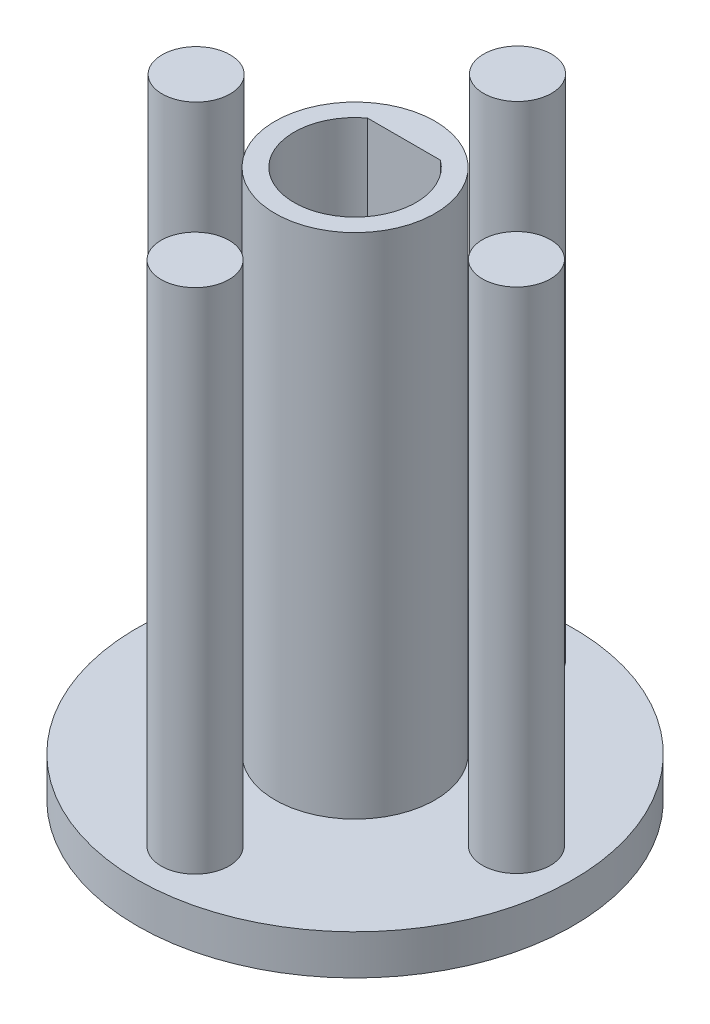
ISO-10303-21;
HEADER;
FILE_DESCRIPTION(('STEP AP214'),'2;1');
FILE_NAME('part.step','',(''),(''),'','','');
FILE_SCHEMA(('AUTOMOTIVE_DESIGN { 1 0 10303 214 1 1 1 1 }'));
ENDSEC;
DATA;
#1=APPLICATION_CONTEXT('core data for automotive mechanical design processes');
#2=APPLICATION_PROTOCOL_DEFINITION('international standard','automotive_design',2000,#1);
#3=PRODUCT_CONTEXT('',#1,'mechanical');
#4=PRODUCT('Part','Part','',(#3));
#5=PRODUCT_RELATED_PRODUCT_CATEGORY('part','',(#4));
#6=PRODUCT_DEFINITION_FORMATION('','',#4);
#7=PRODUCT_DEFINITION_CONTEXT('part definition',#1,'design');
#8=PRODUCT_DEFINITION('design','',#6,#7);
#9=PRODUCT_DEFINITION_SHAPE('','',#8);
#10=(LENGTH_UNIT() NAMED_UNIT(*) SI_UNIT(.MILLI.,.METRE.));
#11=(NAMED_UNIT(*) PLANE_ANGLE_UNIT() SI_UNIT($,.RADIAN.));
#12=(NAMED_UNIT(*) SI_UNIT($,.STERADIAN.) SOLID_ANGLE_UNIT());
#13=UNCERTAINTY_MEASURE_WITH_UNIT(LENGTH_MEASURE(1.E-05),#10,'distance_accuracy_value','');
#14=(GEOMETRIC_REPRESENTATION_CONTEXT(3) GLOBAL_UNCERTAINTY_ASSIGNED_CONTEXT((#13)) GLOBAL_UNIT_ASSIGNED_CONTEXT((#10,
#11,#12)) REPRESENTATION_CONTEXT('',''));
#15=CARTESIAN_POINT('',(0.,0.,0.));
#16=DIRECTION('',(0.,0.,1.));
#17=DIRECTION('',(1.,0.,0.));
#18=AXIS2_PLACEMENT_3D('',#15,#16,#17);
#19=CARTESIAN_POINT('',(0.,2.,0.));
#20=DIRECTION('',(0.,1.,0.));
#21=DIRECTION('',(0.,0.,1.));
#22=AXIS2_PLACEMENT_3D('',#19,#20,#21);
#23=PLANE('',#22);
#24=CARTESIAN_POINT('',(0.,2.,0.));
#25=DIRECTION('',(0.,1.,0.));
#26=DIRECTION('',(0.,0.,1.));
#27=AXIS2_PLACEMENT_3D('',#24,#25,#26);
#28=CIRCLE('',#27,10.9);
#29=CARTESIAN_POINT('',(0.,2.,10.9));
#30=VERTEX_POINT('',#29);
#31=EDGE_CURVE('E112',#30,#30,#28,.T.);
#32=ORIENTED_EDGE('',*,*,#31,.T.);
#33=EDGE_LOOP('',(#32));
#34=FACE_BOUND('',#33,.T.);
#35=CARTESIAN_POINT('',(-7.99946540436632,2.,-0.0531912101153402));
#36=DIRECTION('',(0.,1.,0.));
#37=DIRECTION('',(0.,0.,1.));
#38=AXIS2_PLACEMENT_3D('',#35,#36,#37);
#39=CIRCLE('',#38,1.7);
#40=CARTESIAN_POINT('',(-7.99946540436632,1.99999999999999,-1.75319121011534));
#41=VERTEX_POINT('',#40);
#42=EDGE_CURVE('E48',#41,#41,#39,.T.);
#43=ORIENTED_EDGE('',*,*,#42,.F.);
#44=EDGE_LOOP('',(#43));
#45=FACE_BOUND('',#44,.T.);
#46=CARTESIAN_POINT('',(0.0091799489627781,2.,8.00905715153994));
#47=DIRECTION('',(0.,1.,0.));
#48=DIRECTION('',(0.,0.,1.));
#49=AXIS2_PLACEMENT_3D('',#46,#47,#48);
#50=CIRCLE('',#49,1.7);
#51=CARTESIAN_POINT('',(0.0091799489627781,1.99999999999999,6.30905715153994));
#52=VERTEX_POINT('',#51);
#53=EDGE_CURVE('E108',#52,#52,#50,.F.);
#54=ORIENTED_EDGE('',*,*,#53,.T.);
#55=EDGE_LOOP('',(#54));
#56=FACE_BOUND('',#55,.T.);
#57=CARTESIAN_POINT('',(8.01767982733765,2.,-0.0533357152510716));
#58=DIRECTION('',(0.,1.,0.));
#59=DIRECTION('',(0.,0.,1.));
#60=AXIS2_PLACEMENT_3D('',#57,#58,#59);
#61=CIRCLE('',#60,1.7);
#62=CARTESIAN_POINT('',(8.01767982733765,1.99999999999999,-1.75333571525107));
#63=VERTEX_POINT('',#62);
#64=EDGE_CURVE('E102',#63,#63,#61,.F.);
#65=ORIENTED_EDGE('',*,*,#64,.T.);
#66=EDGE_LOOP('',(#65));
#67=FACE_BOUND('',#66,.T.);
#68=CARTESIAN_POINT('',(0.00903447400855788,2.,-8.11558407690636));
#69=DIRECTION('',(0.,1.,0.));
#70=DIRECTION('',(0.,0.,1.));
#71=AXIS2_PLACEMENT_3D('',#68,#69,#70);
#72=CIRCLE('',#71,1.7);
#73=CARTESIAN_POINT('',(0.00903447400855788,1.99999999999999,-9.81558407690635));
#74=VERTEX_POINT('',#73);
#75=EDGE_CURVE('E96',#74,#74,#72,.F.);
#76=ORIENTED_EDGE('',*,*,#75,.T.);
#77=EDGE_LOOP('',(#76));
#78=FACE_BOUND('',#77,.T.);
#79=CARTESIAN_POINT('',(0.,2.,0.));
#80=DIRECTION('',(0.,1.,0.));
#81=DIRECTION('',(0.,0.,1.));
#82=AXIS2_PLACEMENT_3D('',#79,#80,#81);
#83=CIRCLE('',#82,4.);
#84=CARTESIAN_POINT('',(0.,1.99999999999999,-4.));
#85=VERTEX_POINT('',#84);
#86=EDGE_CURVE('E90',#85,#85,#83,.F.);
#87=ORIENTED_EDGE('',*,*,#86,.T.);
#88=EDGE_LOOP('',(#87));
#89=FACE_BOUND('',#88,.T.);
#90=ADVANCED_FACE('F44',(#34,#45,#56,#67,#78,#89),#23,.T.);
#91=CARTESIAN_POINT('',(-7.99946540436632,27.4,-0.0531912101153402));
#92=DIRECTION('',(0.,-1.,0.));
#93=DIRECTION('',(0.,0.,-1.));
#94=AXIS2_PLACEMENT_3D('',#91,#92,#93);
#95=CYLINDRICAL_SURFACE('',#94,1.7);
#96=CARTESIAN_POINT('',(-7.99946540436632,27.4,-0.0531912101153402));
#97=DIRECTION('',(0.,1.,0.));
#98=DIRECTION('',(0.,0.,1.));
#99=AXIS2_PLACEMENT_3D('',#96,#97,#98);
#100=CIRCLE('',#99,1.7);
#101=CARTESIAN_POINT('',(-7.99946540436632,27.4,-1.75319121011534));
#102=VERTEX_POINT('',#101);
#103=EDGE_CURVE('E12',#102,#102,#100,.T.);
#104=CARTESIAN_POINT('',(-7.99946540436632,1.99999999999999,-1.75319121011534));
#105=CARTESIAN_POINT('',(-7.99946540436632,2.26458333333333,-1.75319121011534));
#106=CARTESIAN_POINT('',(-7.99946540436632,2.52916666666666,-1.75319121011534));
#107=CARTESIAN_POINT('',(-7.99946540436632,3.05833333333333,-1.75319121011534));
#108=CARTESIAN_POINT('',(-7.99946540436632,3.32291666666666,-1.75319121011534));
#109=CARTESIAN_POINT('',(-7.99946540436632,3.85208333333333,-1.75319121011534));
#110=CARTESIAN_POINT('',(-7.99946540436632,4.11666666666666,-1.75319121011534));
#111=CARTESIAN_POINT('',(-7.99946540436632,4.64583333333333,-1.75319121011534));
#112=CARTESIAN_POINT('',(-7.99946540436632,4.91041666666666,-1.75319121011534));
#113=CARTESIAN_POINT('',(-7.99946540436632,5.43958333333333,-1.75319121011534));
#114=CARTESIAN_POINT('',(-7.99946540436632,5.70416666666666,-1.75319121011534));
#115=CARTESIAN_POINT('',(-7.99946540436632,6.23333333333333,-1.75319121011534));
#116=CARTESIAN_POINT('',(-7.99946540436632,6.49791666666666,-1.75319121011534));
#117=CARTESIAN_POINT('',(-7.99946540436632,7.02708333333333,-1.75319121011534));
#118=CARTESIAN_POINT('',(-7.99946540436632,7.29166666666666,-1.75319121011534));
#119=CARTESIAN_POINT('',(-7.99946540436632,7.82083333333333,-1.75319121011534));
#120=CARTESIAN_POINT('',(-7.99946540436632,8.08541666666666,-1.75319121011534));
#121=CARTESIAN_POINT('',(-7.99946540436632,8.61458333333333,-1.75319121011534));
#122=CARTESIAN_POINT('',(-7.99946540436632,8.87916666666666,-1.75319121011534));
#123=CARTESIAN_POINT('',(-7.99946540436632,9.40833333333333,-1.75319121011534));
#124=CARTESIAN_POINT('',(-7.99946540436632,9.67291666666666,-1.75319121011534));
#125=CARTESIAN_POINT('',(-7.99946540436632,10.2020833333333,-1.75319121011534));
#126=CARTESIAN_POINT('',(-7.99946540436632,10.4666666666667,-1.75319121011534));
#127=CARTESIAN_POINT('',(-7.99946540436632,10.9958333333333,-1.75319121011534));
#128=CARTESIAN_POINT('',(-7.99946540436632,11.2604166666667,-1.75319121011534));
#129=CARTESIAN_POINT('',(-7.99946540436632,11.7895833333333,-1.75319121011534));
#130=CARTESIAN_POINT('',(-7.99946540436632,12.0541666666667,-1.75319121011534));
#131=CARTESIAN_POINT('',(-7.99946540436632,12.5833333333333,-1.75319121011534));
#132=CARTESIAN_POINT('',(-7.99946540436632,12.8479166666667,-1.75319121011534));
#133=CARTESIAN_POINT('',(-7.99946540436632,13.3770833333333,-1.75319121011534));
#134=CARTESIAN_POINT('',(-7.99946540436632,13.6416666666667,-1.75319121011534));
#135=CARTESIAN_POINT('',(-7.99946540436632,14.1708333333333,-1.75319121011534));
#136=CARTESIAN_POINT('',(-7.99946540436632,14.4354166666667,-1.75319121011534));
#137=CARTESIAN_POINT('',(-7.99946540436632,14.9645833333333,-1.75319121011534));
#138=CARTESIAN_POINT('',(-7.99946540436632,15.2291666666667,-1.75319121011534));
#139=CARTESIAN_POINT('',(-7.99946540436632,15.7583333333333,-1.75319121011534));
#140=CARTESIAN_POINT('',(-7.99946540436632,16.0229166666667,-1.75319121011534));
#141=CARTESIAN_POINT('',(-7.99946540436632,16.5520833333333,-1.75319121011534));
#142=CARTESIAN_POINT('',(-7.99946540436632,16.8166666666667,-1.75319121011534));
#143=CARTESIAN_POINT('',(-7.99946540436632,17.3458333333333,-1.75319121011534));
#144=CARTESIAN_POINT('',(-7.99946540436632,17.6104166666667,-1.75319121011534));
#145=CARTESIAN_POINT('',(-7.99946540436632,18.1395833333333,-1.75319121011534));
#146=CARTESIAN_POINT('',(-7.99946540436632,18.4041666666667,-1.75319121011534));
#147=CARTESIAN_POINT('',(-7.99946540436632,18.9333333333333,-1.75319121011534));
#148=CARTESIAN_POINT('',(-7.99946540436632,19.1979166666667,-1.75319121011534));
#149=CARTESIAN_POINT('',(-7.99946540436632,19.7270833333333,-1.75319121011534));
#150=CARTESIAN_POINT('',(-7.99946540436632,19.9916666666667,-1.75319121011534));
#151=CARTESIAN_POINT('',(-7.99946540436632,20.5208333333333,-1.75319121011534));
#152=CARTESIAN_POINT('',(-7.99946540436632,20.7854166666667,-1.75319121011534));
#153=CARTESIAN_POINT('',(-7.99946540436632,21.3145833333333,-1.75319121011534));
#154=CARTESIAN_POINT('',(-7.99946540436632,21.5791666666667,-1.75319121011534));
#155=CARTESIAN_POINT('',(-7.99946540436632,22.1083333333333,-1.75319121011534));
#156=CARTESIAN_POINT('',(-7.99946540436632,22.3729166666667,-1.75319121011534));
#157=CARTESIAN_POINT('',(-7.99946540436632,22.9020833333333,-1.75319121011534));
#158=CARTESIAN_POINT('',(-7.99946540436632,23.1666666666667,-1.75319121011534));
#159=CARTESIAN_POINT('',(-7.99946540436632,23.6958333333333,-1.75319121011534));
#160=CARTESIAN_POINT('',(-7.99946540436632,23.9604166666667,-1.75319121011534));
#161=CARTESIAN_POINT('',(-7.99946540436632,24.4895833333333,-1.75319121011534));
#162=CARTESIAN_POINT('',(-7.99946540436632,24.7541666666667,-1.75319121011534));
#163=CARTESIAN_POINT('',(-7.99946540436632,25.2833333333333,-1.75319121011534));
#164=CARTESIAN_POINT('',(-7.99946540436632,25.5479166666667,-1.75319121011534));
#165=CARTESIAN_POINT('',(-7.99946540436632,26.0770833333333,-1.75319121011534));
#166=CARTESIAN_POINT('',(-7.99946540436632,26.3416666666667,-1.75319121011534));
#167=CARTESIAN_POINT('',(-7.99946540436632,26.8708333333333,-1.75319121011534));
#168=CARTESIAN_POINT('',(-7.99946540436632,27.1354166666667,-1.75319121011534));
#169=CARTESIAN_POINT('',(-7.99946540436632,27.4,-1.75319121011534));
#170=B_SPLINE_CURVE_WITH_KNOTS('',3,(#104,#105,#106,#107,#108,#109,#110,#111,#112,#113,#114,
#115,#116,#117,#118,#119,#120,#121,#122,#123,#124,#125,#126,#127,#128,#129,#130,#131,#132,#133,
#134,#135,#136,#137,#138,#139,#140,#141,#142,#143,#144,#145,#146,#147,#148,#149,#150,#151,#152,
#153,#154,#155,#156,#157,#158,#159,#160,#161,#162,#163,#164,#165,#166,#167,#168,#169),
.UNSPECIFIED.,.F.,.F.,(4,2,2,2,2,2,2,2,2,2,2,2,2,2,2,2,2,2,2,2,2,2,2,2,2,2,2,2,2,2,2,2,4),(0.,
0.793749999999999,1.5875,2.38125,3.175,3.96875,4.7625,5.55625,6.35,7.14375,7.9375,8.73125,9.525,
10.31875,11.1125,11.90625,12.7,13.49375,14.2875,15.08125,15.875,16.66875,17.4625,18.25625,19.05,
19.84375,20.6375,21.43125,22.225,23.01875,23.8125,24.60625,25.4),.UNSPECIFIED.);
#171=EDGE_CURVE('BSEAM46',#41,#102,#170,.T.);
#172=ORIENTED_EDGE('',*,*,#42,.T.);
#173=ORIENTED_EDGE('',*,*,#103,.F.);
#174=ORIENTED_EDGE('',*,*,#171,.T.);
#175=ORIENTED_EDGE('',*,*,#171,.F.);
#176=EDGE_LOOP('',(#172,#174,#173,#175));
#177=FACE_BOUND('',#176,.T.);
#178=ADVANCED_FACE('F46',(#177),#95,.T.);
#179=CARTESIAN_POINT('',(-7.99946540436632,27.4,-0.0531912101153402));
#180=DIRECTION('',(0.,1.,0.));
#181=DIRECTION('',(0.,0.,1.));
#182=AXIS2_PLACEMENT_3D('',#179,#180,#181);
#183=PLANE('',#182);
#184=ORIENTED_EDGE('',*,*,#103,.T.);
#185=EDGE_LOOP('',(#184));
#186=FACE_BOUND('',#185,.T.);
#187=ADVANCED_FACE('F130',(#186),#183,.T.);
#188=CARTESIAN_POINT('',(0.,2.,0.));
#189=DIRECTION('',(0.,-1.,0.));
#190=DIRECTION('',(0.,0.,-1.));
#191=AXIS2_PLACEMENT_3D('',#188,#189,#190);
#192=CYLINDRICAL_SURFACE('',#191,10.9);
#193=ORIENTED_EDGE('',*,*,#31,.F.);
#194=EDGE_LOOP('',(#193));
#195=FACE_BOUND('',#194,.T.);
#196=CARTESIAN_POINT('',(0.,0.,0.));
#197=DIRECTION('',(0.,1.,0.));
#198=DIRECTION('',(0.,0.,1.));
#199=AXIS2_PLACEMENT_3D('',#196,#197,#198);
#200=CIRCLE('',#199,10.9);
#201=CARTESIAN_POINT('',(0.,0.,10.9));
#202=VERTEX_POINT('',#201);
#203=EDGE_CURVE('E111',#202,#202,#200,.T.);
#204=ORIENTED_EDGE('',*,*,#203,.T.);
#205=EDGE_LOOP('',(#204));
#206=FACE_BOUND('',#205,.T.);
#207=ADVANCED_FACE('F118',(#195,#206),#192,.T.);
#208=CARTESIAN_POINT('',(-7.99946540436632,0.,-0.0531912101153402));
#209=DIRECTION('',(0.,1.,0.));
#210=DIRECTION('',(0.,0.,1.));
#211=AXIS2_PLACEMENT_3D('',#208,#209,#210);
#212=PLANE('',#211);
#213=ORIENTED_EDGE('',*,*,#203,.F.);
#214=EDGE_LOOP('',(#213));
#215=FACE_BOUND('',#214,.T.);
#216=ADVANCED_FACE('F120',(#215),#212,.F.);
#217=CARTESIAN_POINT('',(0.0091799489627781,27.4,8.00905715153994));
#218=DIRECTION('',(0.,-1.,0.));
#219=DIRECTION('',(0.,0.,-1.));
#220=AXIS2_PLACEMENT_3D('',#217,#218,#219);
#221=CYLINDRICAL_SURFACE('',#220,1.7);
#222=CARTESIAN_POINT('',(0.0091799489627781,27.4,8.00905715153994));
#223=DIRECTION('',(0.,1.,0.));
#224=DIRECTION('',(0.,0.,1.));
#225=AXIS2_PLACEMENT_3D('',#222,#223,#224);
#226=CIRCLE('',#225,1.7);
#227=CARTESIAN_POINT('',(0.0091799489627781,27.4,6.30905715153994));
#228=VERTEX_POINT('',#227);
#229=EDGE_CURVE('E105',#228,#228,#226,.T.);
#230=CARTESIAN_POINT('',(0.0091799489627781,1.99999999999999,6.30905715153994));
#231=CARTESIAN_POINT('',(0.0091799489627781,2.26458333333333,6.30905715153994));
#232=CARTESIAN_POINT('',(0.0091799489627781,2.52916666666666,6.30905715153994));
#233=CARTESIAN_POINT('',(0.0091799489627781,3.05833333333333,6.30905715153994));
#234=CARTESIAN_POINT('',(0.0091799489627781,3.32291666666666,6.30905715153994));
#235=CARTESIAN_POINT('',(0.0091799489627781,3.85208333333333,6.30905715153994));
#236=CARTESIAN_POINT('',(0.0091799489627781,4.11666666666666,6.30905715153994));
#237=CARTESIAN_POINT('',(0.0091799489627781,4.64583333333333,6.30905715153994));
#238=CARTESIAN_POINT('',(0.0091799489627781,4.91041666666666,6.30905715153994));
#239=CARTESIAN_POINT('',(0.0091799489627781,5.43958333333333,6.30905715153994));
#240=CARTESIAN_POINT('',(0.0091799489627781,5.70416666666666,6.30905715153994));
#241=CARTESIAN_POINT('',(0.0091799489627781,6.23333333333333,6.30905715153994));
#242=CARTESIAN_POINT('',(0.0091799489627781,6.49791666666666,6.30905715153994));
#243=CARTESIAN_POINT('',(0.0091799489627781,7.02708333333333,6.30905715153994));
#244=CARTESIAN_POINT('',(0.0091799489627781,7.29166666666666,6.30905715153994));
#245=CARTESIAN_POINT('',(0.0091799489627781,7.82083333333333,6.30905715153994));
#246=CARTESIAN_POINT('',(0.0091799489627781,8.08541666666666,6.30905715153994));
#247=CARTESIAN_POINT('',(0.0091799489627781,8.61458333333333,6.30905715153994));
#248=CARTESIAN_POINT('',(0.0091799489627781,8.87916666666666,6.30905715153994));
#249=CARTESIAN_POINT('',(0.0091799489627781,9.40833333333333,6.30905715153994));
#250=CARTESIAN_POINT('',(0.0091799489627781,9.67291666666666,6.30905715153994));
#251=CARTESIAN_POINT('',(0.0091799489627781,10.2020833333333,6.30905715153994));
#252=CARTESIAN_POINT('',(0.0091799489627781,10.4666666666667,6.30905715153994));
#253=CARTESIAN_POINT('',(0.0091799489627781,10.9958333333333,6.30905715153994));
#254=CARTESIAN_POINT('',(0.0091799489627781,11.2604166666667,6.30905715153994));
#255=CARTESIAN_POINT('',(0.0091799489627781,11.7895833333333,6.30905715153994));
#256=CARTESIAN_POINT('',(0.0091799489627781,12.0541666666667,6.30905715153994));
#257=CARTESIAN_POINT('',(0.0091799489627781,12.5833333333333,6.30905715153994));
#258=CARTESIAN_POINT('',(0.0091799489627781,12.8479166666667,6.30905715153994));
#259=CARTESIAN_POINT('',(0.0091799489627781,13.3770833333333,6.30905715153994));
#260=CARTESIAN_POINT('',(0.0091799489627781,13.6416666666667,6.30905715153994));
#261=CARTESIAN_POINT('',(0.0091799489627781,14.1708333333333,6.30905715153994));
#262=CARTESIAN_POINT('',(0.0091799489627781,14.4354166666667,6.30905715153994));
#263=CARTESIAN_POINT('',(0.0091799489627781,14.9645833333333,6.30905715153994));
#264=CARTESIAN_POINT('',(0.0091799489627781,15.2291666666667,6.30905715153994));
#265=CARTESIAN_POINT('',(0.0091799489627781,15.7583333333333,6.30905715153994));
#266=CARTESIAN_POINT('',(0.0091799489627781,16.0229166666667,6.30905715153994));
#267=CARTESIAN_POINT('',(0.0091799489627781,16.5520833333333,6.30905715153994));
#268=CARTESIAN_POINT('',(0.0091799489627781,16.8166666666667,6.30905715153994));
#269=CARTESIAN_POINT('',(0.0091799489627781,17.3458333333333,6.30905715153994));
#270=CARTESIAN_POINT('',(0.0091799489627781,17.6104166666667,6.30905715153994));
#271=CARTESIAN_POINT('',(0.0091799489627781,18.1395833333333,6.30905715153994));
#272=CARTESIAN_POINT('',(0.0091799489627781,18.4041666666667,6.30905715153994));
#273=CARTESIAN_POINT('',(0.0091799489627781,18.9333333333333,6.30905715153994));
#274=CARTESIAN_POINT('',(0.0091799489627781,19.1979166666667,6.30905715153994));
#275=CARTESIAN_POINT('',(0.0091799489627781,19.7270833333333,6.30905715153994));
#276=CARTESIAN_POINT('',(0.0091799489627781,19.9916666666667,6.30905715153994));
#277=CARTESIAN_POINT('',(0.0091799489627781,20.5208333333333,6.30905715153994));
#278=CARTESIAN_POINT('',(0.0091799489627781,20.7854166666667,6.30905715153994));
#279=CARTESIAN_POINT('',(0.0091799489627781,21.3145833333333,6.30905715153994));
#280=CARTESIAN_POINT('',(0.0091799489627781,21.5791666666667,6.30905715153994));
#281=CARTESIAN_POINT('',(0.0091799489627781,22.1083333333333,6.30905715153994));
#282=CARTESIAN_POINT('',(0.0091799489627781,22.3729166666667,6.30905715153994));
#283=CARTESIAN_POINT('',(0.0091799489627781,22.9020833333333,6.30905715153994));
#284=CARTESIAN_POINT('',(0.0091799489627781,23.1666666666667,6.30905715153994));
#285=CARTESIAN_POINT('',(0.0091799489627781,23.6958333333333,6.30905715153994));
#286=CARTESIAN_POINT('',(0.0091799489627781,23.9604166666667,6.30905715153994));
#287=CARTESIAN_POINT('',(0.0091799489627781,24.4895833333333,6.30905715153994));
#288=CARTESIAN_POINT('',(0.0091799489627781,24.7541666666667,6.30905715153994));
#289=CARTESIAN_POINT('',(0.0091799489627781,25.2833333333333,6.30905715153994));
#290=CARTESIAN_POINT('',(0.0091799489627781,25.5479166666667,6.30905715153994));
#291=CARTESIAN_POINT('',(0.0091799489627781,26.0770833333333,6.30905715153994));
#292=CARTESIAN_POINT('',(0.0091799489627781,26.3416666666667,6.30905715153994));
#293=CARTESIAN_POINT('',(0.0091799489627781,26.8708333333333,6.30905715153994));
#294=CARTESIAN_POINT('',(0.0091799489627781,27.1354166666667,6.30905715153994));
#295=CARTESIAN_POINT('',(0.0091799489627781,27.4,6.30905715153994));
#296=B_SPLINE_CURVE_WITH_KNOTS('',3,(#230,#231,#232,#233,#234,#235,#236,#237,#238,#239,#240,
#241,#242,#243,#244,#245,#246,#247,#248,#249,#250,#251,#252,#253,#254,#255,#256,#257,#258,#259,
#260,#261,#262,#263,#264,#265,#266,#267,#268,#269,#270,#271,#272,#273,#274,#275,#276,#277,#278,
#279,#280,#281,#282,#283,#284,#285,#286,#287,#288,#289,#290,#291,#292,#293,#294,#295),
.UNSPECIFIED.,.F.,.F.,(4,2,2,2,2,2,2,2,2,2,2,2,2,2,2,2,2,2,2,2,2,2,2,2,2,2,2,2,2,2,2,2,4),(0.,
0.793749999999999,1.5875,2.38125,3.175,3.96875,4.7625,5.55625,6.35,7.14375,7.9375,8.73125,9.525,
10.31875,11.1125,11.90625,12.7,13.49375,14.2875,15.08125,15.875,16.66875,17.4625,18.25625,19.05,
19.84375,20.6375,21.43125,22.225,23.01875,23.8125,24.60625,25.4),.UNSPECIFIED.);
#297=EDGE_CURVE('BSEAM122',#52,#228,#296,.T.);
#298=ORIENTED_EDGE('',*,*,#53,.F.);
#299=ORIENTED_EDGE('',*,*,#229,.F.);
#300=ORIENTED_EDGE('',*,*,#297,.T.);
#301=ORIENTED_EDGE('',*,*,#297,.F.);
#302=EDGE_LOOP('',(#298,#300,#299,#301));
#303=FACE_BOUND('',#302,.T.);
#304=ADVANCED_FACE('F122',(#303),#221,.T.);
#305=CARTESIAN_POINT('',(0.0091799489627781,27.4,8.00905715153994));
#306=DIRECTION('',(0.,1.,0.));
#307=DIRECTION('',(0.,0.,1.));
#308=AXIS2_PLACEMENT_3D('',#305,#306,#307);
#309=PLANE('',#308);
#310=ORIENTED_EDGE('',*,*,#229,.T.);
#311=EDGE_LOOP('',(#310));
#312=FACE_BOUND('',#311,.T.);
#313=ADVANCED_FACE('F127',(#312),#309,.T.);
#314=CARTESIAN_POINT('',(8.01767982733765,27.4,-0.0533357152510716));
#315=DIRECTION('',(0.,-1.,0.));
#316=DIRECTION('',(0.,0.,-1.));
#317=AXIS2_PLACEMENT_3D('',#314,#315,#316);
#318=CYLINDRICAL_SURFACE('',#317,1.7);
#319=CARTESIAN_POINT('',(8.01767982733765,27.4,-0.0533357152510716));
#320=DIRECTION('',(0.,1.,0.));
#321=DIRECTION('',(0.,0.,1.));
#322=AXIS2_PLACEMENT_3D('',#319,#320,#321);
#323=CIRCLE('',#322,1.7);
#324=CARTESIAN_POINT('',(8.01767982733765,27.4,-1.75333571525107));
#325=VERTEX_POINT('',#324);
#326=EDGE_CURVE('E99',#325,#325,#323,.T.);
#327=CARTESIAN_POINT('',(8.01767982733765,1.99999999999999,-1.75333571525107));
#328=CARTESIAN_POINT('',(8.01767982733765,2.26458333333333,-1.75333571525107));
#329=CARTESIAN_POINT('',(8.01767982733765,2.52916666666666,-1.75333571525107));
#330=CARTESIAN_POINT('',(8.01767982733765,3.05833333333333,-1.75333571525107));
#331=CARTESIAN_POINT('',(8.01767982733765,3.32291666666666,-1.75333571525107));
#332=CARTESIAN_POINT('',(8.01767982733765,3.85208333333333,-1.75333571525107));
#333=CARTESIAN_POINT('',(8.01767982733765,4.11666666666666,-1.75333571525107));
#334=CARTESIAN_POINT('',(8.01767982733765,4.64583333333333,-1.75333571525107));
#335=CARTESIAN_POINT('',(8.01767982733765,4.91041666666666,-1.75333571525107));
#336=CARTESIAN_POINT('',(8.01767982733765,5.43958333333333,-1.75333571525107));
#337=CARTESIAN_POINT('',(8.01767982733765,5.70416666666666,-1.75333571525107));
#338=CARTESIAN_POINT('',(8.01767982733765,6.23333333333333,-1.75333571525107));
#339=CARTESIAN_POINT('',(8.01767982733765,6.49791666666666,-1.75333571525107));
#340=CARTESIAN_POINT('',(8.01767982733765,7.02708333333333,-1.75333571525107));
#341=CARTESIAN_POINT('',(8.01767982733765,7.29166666666666,-1.75333571525107));
#342=CARTESIAN_POINT('',(8.01767982733765,7.82083333333333,-1.75333571525107));
#343=CARTESIAN_POINT('',(8.01767982733765,8.08541666666666,-1.75333571525107));
#344=CARTESIAN_POINT('',(8.01767982733765,8.61458333333333,-1.75333571525107));
#345=CARTESIAN_POINT('',(8.01767982733765,8.87916666666666,-1.75333571525107));
#346=CARTESIAN_POINT('',(8.01767982733765,9.40833333333333,-1.75333571525107));
#347=CARTESIAN_POINT('',(8.01767982733765,9.67291666666666,-1.75333571525107));
#348=CARTESIAN_POINT('',(8.01767982733765,10.2020833333333,-1.75333571525107));
#349=CARTESIAN_POINT('',(8.01767982733765,10.4666666666667,-1.75333571525107));
#350=CARTESIAN_POINT('',(8.01767982733765,10.9958333333333,-1.75333571525107));
#351=CARTESIAN_POINT('',(8.01767982733765,11.2604166666667,-1.75333571525107));
#352=CARTESIAN_POINT('',(8.01767982733765,11.7895833333333,-1.75333571525107));
#353=CARTESIAN_POINT('',(8.01767982733765,12.0541666666667,-1.75333571525107));
#354=CARTESIAN_POINT('',(8.01767982733765,12.5833333333333,-1.75333571525107));
#355=CARTESIAN_POINT('',(8.01767982733765,12.8479166666667,-1.75333571525107));
#356=CARTESIAN_POINT('',(8.01767982733765,13.3770833333333,-1.75333571525107));
#357=CARTESIAN_POINT('',(8.01767982733765,13.6416666666667,-1.75333571525107));
#358=CARTESIAN_POINT('',(8.01767982733765,14.1708333333333,-1.75333571525107));
#359=CARTESIAN_POINT('',(8.01767982733765,14.4354166666667,-1.75333571525107));
#360=CARTESIAN_POINT('',(8.01767982733765,14.9645833333333,-1.75333571525107));
#361=CARTESIAN_POINT('',(8.01767982733765,15.2291666666667,-1.75333571525107));
#362=CARTESIAN_POINT('',(8.01767982733765,15.7583333333333,-1.75333571525107));
#363=CARTESIAN_POINT('',(8.01767982733765,16.0229166666667,-1.75333571525107));
#364=CARTESIAN_POINT('',(8.01767982733765,16.5520833333333,-1.75333571525107));
#365=CARTESIAN_POINT('',(8.01767982733765,16.8166666666667,-1.75333571525107));
#366=CARTESIAN_POINT('',(8.01767982733765,17.3458333333333,-1.75333571525107));
#367=CARTESIAN_POINT('',(8.01767982733765,17.6104166666667,-1.75333571525107));
#368=CARTESIAN_POINT('',(8.01767982733765,18.1395833333333,-1.75333571525107));
#369=CARTESIAN_POINT('',(8.01767982733765,18.4041666666667,-1.75333571525107));
#370=CARTESIAN_POINT('',(8.01767982733765,18.9333333333333,-1.75333571525107));
#371=CARTESIAN_POINT('',(8.01767982733765,19.1979166666667,-1.75333571525107));
#372=CARTESIAN_POINT('',(8.01767982733765,19.7270833333333,-1.75333571525107));
#373=CARTESIAN_POINT('',(8.01767982733765,19.9916666666667,-1.75333571525107));
#374=CARTESIAN_POINT('',(8.01767982733765,20.5208333333333,-1.75333571525107));
#375=CARTESIAN_POINT('',(8.01767982733765,20.7854166666667,-1.75333571525107));
#376=CARTESIAN_POINT('',(8.01767982733765,21.3145833333333,-1.75333571525107));
#377=CARTESIAN_POINT('',(8.01767982733765,21.5791666666667,-1.75333571525107));
#378=CARTESIAN_POINT('',(8.01767982733765,22.1083333333333,-1.75333571525107));
#379=CARTESIAN_POINT('',(8.01767982733765,22.3729166666667,-1.75333571525107));
#380=CARTESIAN_POINT('',(8.01767982733765,22.9020833333333,-1.75333571525107));
#381=CARTESIAN_POINT('',(8.01767982733765,23.1666666666667,-1.75333571525107));
#382=CARTESIAN_POINT('',(8.01767982733765,23.6958333333333,-1.75333571525107));
#383=CARTESIAN_POINT('',(8.01767982733765,23.9604166666667,-1.75333571525107));
#384=CARTESIAN_POINT('',(8.01767982733765,24.4895833333333,-1.75333571525107));
#385=CARTESIAN_POINT('',(8.01767982733765,24.7541666666667,-1.75333571525107));
#386=CARTESIAN_POINT('',(8.01767982733765,25.2833333333333,-1.75333571525107));
#387=CARTESIAN_POINT('',(8.01767982733765,25.5479166666667,-1.75333571525107));
#388=CARTESIAN_POINT('',(8.01767982733765,26.0770833333333,-1.75333571525107));
#389=CARTESIAN_POINT('',(8.01767982733765,26.3416666666667,-1.75333571525107));
#390=CARTESIAN_POINT('',(8.01767982733765,26.8708333333333,-1.75333571525107));
#391=CARTESIAN_POINT('',(8.01767982733765,27.1354166666667,-1.75333571525107));
#392=CARTESIAN_POINT('',(8.01767982733765,27.4,-1.75333571525107));
#393=B_SPLINE_CURVE_WITH_KNOTS('',3,(#327,#328,#329,#330,#331,#332,#333,#334,#335,#336,#337,
#338,#339,#340,#341,#342,#343,#344,#345,#346,#347,#348,#349,#350,#351,#352,#353,#354,#355,#356,
#357,#358,#359,#360,#361,#362,#363,#364,#365,#366,#367,#368,#369,#370,#371,#372,#373,#374,#375,
#376,#377,#378,#379,#380,#381,#382,#383,#384,#385,#386,#387,#388,#389,#390,#391,#392),
.UNSPECIFIED.,.F.,.F.,(4,2,2,2,2,2,2,2,2,2,2,2,2,2,2,2,2,2,2,2,2,2,2,2,2,2,2,2,2,2,2,2,4),(0.,
0.793749999999999,1.5875,2.38125,3.175,3.96875,4.7625,5.55625,6.35,7.14375,7.9375,8.73125,9.525,
10.31875,11.1125,11.90625,12.7,13.49375,14.2875,15.08125,15.875,16.66875,17.4625,18.25625,19.05,
19.84375,20.6375,21.43125,22.225,23.01875,23.8125,24.60625,25.4),.UNSPECIFIED.);
#394=EDGE_CURVE('BSEAM166',#63,#325,#393,.T.);
#395=ORIENTED_EDGE('',*,*,#64,.F.);
#396=ORIENTED_EDGE('',*,*,#326,.F.);
#397=ORIENTED_EDGE('',*,*,#394,.T.);
#398=ORIENTED_EDGE('',*,*,#394,.F.);
#399=EDGE_LOOP('',(#395,#397,#396,#398));
#400=FACE_BOUND('',#399,.T.);
#401=ADVANCED_FACE('F166',(#400),#318,.T.);
#402=CARTESIAN_POINT('',(8.01767982733765,27.4,-0.0533357152510716));
#403=DIRECTION('',(0.,1.,0.));
#404=DIRECTION('',(0.,0.,1.));
#405=AXIS2_PLACEMENT_3D('',#402,#403,#404);
#406=PLANE('',#405);
#407=ORIENTED_EDGE('',*,*,#326,.T.);
#408=EDGE_LOOP('',(#407));
#409=FACE_BOUND('',#408,.T.);
#410=ADVANCED_FACE('F161',(#409),#406,.T.);
#411=CARTESIAN_POINT('',(0.00903447400855788,27.4,-8.11558407690636));
#412=DIRECTION('',(0.,-1.,0.));
#413=DIRECTION('',(0.,0.,-1.));
#414=AXIS2_PLACEMENT_3D('',#411,#412,#413);
#415=CYLINDRICAL_SURFACE('',#414,1.7);
#416=CARTESIAN_POINT('',(0.00903447400855788,27.4,-8.11558407690636));
#417=DIRECTION('',(0.,1.,0.));
#418=DIRECTION('',(0.,0.,1.));
#419=AXIS2_PLACEMENT_3D('',#416,#417,#418);
#420=CIRCLE('',#419,1.7);
#421=CARTESIAN_POINT('',(0.00903447400855788,27.4,-9.81558407690635));
#422=VERTEX_POINT('',#421);
#423=EDGE_CURVE('E93',#422,#422,#420,.T.);
#424=CARTESIAN_POINT('',(0.00903447400855788,1.99999999999999,-9.81558407690635));
#425=CARTESIAN_POINT('',(0.00903447400855788,2.26458333333333,-9.81558407690635));
#426=CARTESIAN_POINT('',(0.00903447400855788,2.52916666666666,-9.81558407690635));
#427=CARTESIAN_POINT('',(0.00903447400855788,3.05833333333333,-9.81558407690635));
#428=CARTESIAN_POINT('',(0.00903447400855788,3.32291666666666,-9.81558407690635));
#429=CARTESIAN_POINT('',(0.00903447400855788,3.85208333333333,-9.81558407690635));
#430=CARTESIAN_POINT('',(0.00903447400855788,4.11666666666666,-9.81558407690635));
#431=CARTESIAN_POINT('',(0.00903447400855788,4.64583333333333,-9.81558407690635));
#432=CARTESIAN_POINT('',(0.00903447400855788,4.91041666666666,-9.81558407690635));
#433=CARTESIAN_POINT('',(0.00903447400855788,5.43958333333333,-9.81558407690635));
#434=CARTESIAN_POINT('',(0.00903447400855788,5.70416666666666,-9.81558407690635));
#435=CARTESIAN_POINT('',(0.00903447400855788,6.23333333333333,-9.81558407690635));
#436=CARTESIAN_POINT('',(0.00903447400855788,6.49791666666666,-9.81558407690635));
#437=CARTESIAN_POINT('',(0.00903447400855788,7.02708333333333,-9.81558407690635));
#438=CARTESIAN_POINT('',(0.00903447400855788,7.29166666666666,-9.81558407690635));
#439=CARTESIAN_POINT('',(0.00903447400855788,7.82083333333333,-9.81558407690635));
#440=CARTESIAN_POINT('',(0.00903447400855788,8.08541666666666,-9.81558407690635));
#441=CARTESIAN_POINT('',(0.00903447400855788,8.61458333333333,-9.81558407690635));
#442=CARTESIAN_POINT('',(0.00903447400855788,8.87916666666666,-9.81558407690635));
#443=CARTESIAN_POINT('',(0.00903447400855788,9.40833333333333,-9.81558407690635));
#444=CARTESIAN_POINT('',(0.00903447400855788,9.67291666666666,-9.81558407690635));
#445=CARTESIAN_POINT('',(0.00903447400855788,10.2020833333333,-9.81558407690635));
#446=CARTESIAN_POINT('',(0.00903447400855788,10.4666666666667,-9.81558407690635));
#447=CARTESIAN_POINT('',(0.00903447400855788,10.9958333333333,-9.81558407690635));
#448=CARTESIAN_POINT('',(0.00903447400855788,11.2604166666667,-9.81558407690635));
#449=CARTESIAN_POINT('',(0.00903447400855788,11.7895833333333,-9.81558407690635));
#450=CARTESIAN_POINT('',(0.00903447400855788,12.0541666666667,-9.81558407690635));
#451=CARTESIAN_POINT('',(0.00903447400855788,12.5833333333333,-9.81558407690635));
#452=CARTESIAN_POINT('',(0.00903447400855788,12.8479166666667,-9.81558407690635));
#453=CARTESIAN_POINT('',(0.00903447400855788,13.3770833333333,-9.81558407690635));
#454=CARTESIAN_POINT('',(0.00903447400855788,13.6416666666667,-9.81558407690635));
#455=CARTESIAN_POINT('',(0.00903447400855788,14.1708333333333,-9.81558407690635));
#456=CARTESIAN_POINT('',(0.00903447400855788,14.4354166666667,-9.81558407690635));
#457=CARTESIAN_POINT('',(0.00903447400855788,14.9645833333333,-9.81558407690635));
#458=CARTESIAN_POINT('',(0.00903447400855788,15.2291666666667,-9.81558407690635));
#459=CARTESIAN_POINT('',(0.00903447400855788,15.7583333333333,-9.81558407690635));
#460=CARTESIAN_POINT('',(0.00903447400855788,16.0229166666667,-9.81558407690635));
#461=CARTESIAN_POINT('',(0.00903447400855788,16.5520833333333,-9.81558407690635));
#462=CARTESIAN_POINT('',(0.00903447400855788,16.8166666666667,-9.81558407690635));
#463=CARTESIAN_POINT('',(0.00903447400855788,17.3458333333333,-9.81558407690635));
#464=CARTESIAN_POINT('',(0.00903447400855788,17.6104166666667,-9.81558407690635));
#465=CARTESIAN_POINT('',(0.00903447400855788,18.1395833333333,-9.81558407690635));
#466=CARTESIAN_POINT('',(0.00903447400855788,18.4041666666667,-9.81558407690635));
#467=CARTESIAN_POINT('',(0.00903447400855788,18.9333333333333,-9.81558407690635));
#468=CARTESIAN_POINT('',(0.00903447400855788,19.1979166666667,-9.81558407690635));
#469=CARTESIAN_POINT('',(0.00903447400855788,19.7270833333333,-9.81558407690635));
#470=CARTESIAN_POINT('',(0.00903447400855788,19.9916666666667,-9.81558407690635));
#471=CARTESIAN_POINT('',(0.00903447400855788,20.5208333333333,-9.81558407690635));
#472=CARTESIAN_POINT('',(0.00903447400855788,20.7854166666667,-9.81558407690635));
#473=CARTESIAN_POINT('',(0.00903447400855788,21.3145833333333,-9.81558407690635));
#474=CARTESIAN_POINT('',(0.00903447400855788,21.5791666666667,-9.81558407690635));
#475=CARTESIAN_POINT('',(0.00903447400855788,22.1083333333333,-9.81558407690635));
#476=CARTESIAN_POINT('',(0.00903447400855788,22.3729166666667,-9.81558407690635));
#477=CARTESIAN_POINT('',(0.00903447400855788,22.9020833333333,-9.81558407690635));
#478=CARTESIAN_POINT('',(0.00903447400855788,23.1666666666667,-9.81558407690635));
#479=CARTESIAN_POINT('',(0.00903447400855788,23.6958333333333,-9.81558407690635));
#480=CARTESIAN_POINT('',(0.00903447400855788,23.9604166666667,-9.81558407690635));
#481=CARTESIAN_POINT('',(0.00903447400855788,24.4895833333333,-9.81558407690635));
#482=CARTESIAN_POINT('',(0.00903447400855788,24.7541666666667,-9.81558407690635));
#483=CARTESIAN_POINT('',(0.00903447400855788,25.2833333333333,-9.81558407690635));
#484=CARTESIAN_POINT('',(0.00903447400855788,25.5479166666667,-9.81558407690635));
#485=CARTESIAN_POINT('',(0.00903447400855788,26.0770833333333,-9.81558407690635));
#486=CARTESIAN_POINT('',(0.00903447400855788,26.3416666666667,-9.81558407690635));
#487=CARTESIAN_POINT('',(0.00903447400855788,26.8708333333333,-9.81558407690635));
#488=CARTESIAN_POINT('',(0.00903447400855788,27.1354166666667,-9.81558407690635));
#489=CARTESIAN_POINT('',(0.00903447400855788,27.4,-9.81558407690635));
#490=B_SPLINE_CURVE_WITH_KNOTS('',3,(#424,#425,#426,#427,#428,#429,#430,#431,#432,#433,#434,
#435,#436,#437,#438,#439,#440,#441,#442,#443,#444,#445,#446,#447,#448,#449,#450,#451,#452,#453,
#454,#455,#456,#457,#458,#459,#460,#461,#462,#463,#464,#465,#466,#467,#468,#469,#470,#471,#472,
#473,#474,#475,#476,#477,#478,#479,#480,#481,#482,#483,#484,#485,#486,#487,#488,#489),
.UNSPECIFIED.,.F.,.F.,(4,2,2,2,2,2,2,2,2,2,2,2,2,2,2,2,2,2,2,2,2,2,2,2,2,2,2,2,2,2,2,2,4),(0.,
0.793749999999999,1.5875,2.38125,3.175,3.96875,4.7625,5.55625,6.35,7.14375,7.9375,8.73125,9.525,
10.31875,11.1125,11.90625,12.7,13.49375,14.2875,15.08125,15.875,16.66875,17.4625,18.25625,19.05,
19.84375,20.6375,21.43125,22.225,23.01875,23.8125,24.60625,25.4),.UNSPECIFIED.);
#491=EDGE_CURVE('BSEAM157',#74,#422,#490,.T.);
#492=ORIENTED_EDGE('',*,*,#75,.F.);
#493=ORIENTED_EDGE('',*,*,#423,.F.);
#494=ORIENTED_EDGE('',*,*,#491,.T.);
#495=ORIENTED_EDGE('',*,*,#491,.F.);
#496=EDGE_LOOP('',(#492,#494,#493,#495));
#497=FACE_BOUND('',#496,.T.);
#498=ADVANCED_FACE('F157',(#497),#415,.T.);
#499=CARTESIAN_POINT('',(0.00903447400855788,27.4,-8.11558407690636));
#500=DIRECTION('',(0.,1.,0.));
#501=DIRECTION('',(0.,0.,1.));
#502=AXIS2_PLACEMENT_3D('',#499,#500,#501);
#503=PLANE('',#502);
#504=ORIENTED_EDGE('',*,*,#423,.T.);
#505=EDGE_LOOP('',(#504));
#506=FACE_BOUND('',#505,.T.);
#507=ADVANCED_FACE('F160',(#506),#503,.T.);
#508=CARTESIAN_POINT('',(0.,27.4,0.));
#509=DIRECTION('',(0.,1.,0.));
#510=DIRECTION('',(0.,0.,1.));
#511=AXIS2_PLACEMENT_3D('',#508,#509,#510);
#512=PLANE('',#511);
#513=CARTESIAN_POINT('',(0.,27.4,0.));
#514=DIRECTION('',(0.,1.,0.));
#515=DIRECTION('',(0.,0.,1.));
#516=AXIS2_PLACEMENT_3D('',#513,#514,#515);
#517=CIRCLE('',#516,4.);
#518=CARTESIAN_POINT('',(0.,27.4,-4.));
#519=VERTEX_POINT('',#518);
#520=EDGE_CURVE('E77',#519,#519,#517,.T.);
#521=ORIENTED_EDGE('',*,*,#520,.T.);
#522=EDGE_LOOP('',(#521));
#523=FACE_BOUND('',#522,.T.);
#524=DIRECTION('',(1.,0.,0.));
#525=VECTOR('',#524,1.);
#526=CARTESIAN_POINT('',(-1.82309834328727,27.4,-2.4451610234713));
#527=LINE('',#526,#525);
#528=CARTESIAN_POINT('',(-1.82309834328727,27.4,-2.4451610234713));
#529=VERTEX_POINT('',#528);
#530=CARTESIAN_POINT('',(1.82309834328727,27.4,-2.4451610234713));
#531=VERTEX_POINT('',#530);
#532=EDGE_CURVE('E73',#529,#531,#527,.T.);
#533=ORIENTED_EDGE('',*,*,#532,.T.);
#534=CARTESIAN_POINT('',(0.,27.4,0.));
#535=DIRECTION('',(0.,1.,0.));
#536=DIRECTION('',(0.,0.,1.));
#537=AXIS2_PLACEMENT_3D('',#534,#535,#536);
#538=CIRCLE('',#537,3.05);
#539=EDGE_CURVE('E79',#529,#531,#538,.T.);
#540=ORIENTED_EDGE('',*,*,#539,.F.);
#541=EDGE_LOOP('',(#533,#540));
#542=FACE_BOUND('',#541,.T.);
#543=ADVANCED_FACE('F83',(#523,#542),#512,.T.);
#544=CARTESIAN_POINT('',(0.,27.4,0.));
#545=DIRECTION('',(0.,-1.,0.));
#546=DIRECTION('',(0.,0.,-1.));
#547=AXIS2_PLACEMENT_3D('',#544,#545,#546);
#548=CYLINDRICAL_SURFACE('',#547,4.);
#549=CARTESIAN_POINT('',(0.,1.99999999999999,-4.));
#550=CARTESIAN_POINT('',(0.,2.26458333333333,-4.));
#551=CARTESIAN_POINT('',(0.,2.52916666666666,-4.));
#552=CARTESIAN_POINT('',(0.,3.05833333333333,-4.));
#553=CARTESIAN_POINT('',(0.,3.32291666666666,-4.));
#554=CARTESIAN_POINT('',(0.,3.85208333333333,-4.));
#555=CARTESIAN_POINT('',(0.,4.11666666666666,-4.));
#556=CARTESIAN_POINT('',(0.,4.64583333333333,-4.));
#557=CARTESIAN_POINT('',(0.,4.91041666666666,-4.));
#558=CARTESIAN_POINT('',(0.,5.43958333333333,-4.));
#559=CARTESIAN_POINT('',(0.,5.70416666666666,-4.));
#560=CARTESIAN_POINT('',(0.,6.23333333333333,-4.));
#561=CARTESIAN_POINT('',(0.,6.49791666666666,-4.));
#562=CARTESIAN_POINT('',(0.,7.02708333333333,-4.));
#563=CARTESIAN_POINT('',(0.,7.29166666666666,-4.));
#564=CARTESIAN_POINT('',(0.,7.82083333333333,-4.));
#565=CARTESIAN_POINT('',(0.,8.08541666666666,-4.));
#566=CARTESIAN_POINT('',(0.,8.61458333333333,-4.));
#567=CARTESIAN_POINT('',(0.,8.87916666666666,-4.));
#568=CARTESIAN_POINT('',(0.,9.40833333333333,-4.));
#569=CARTESIAN_POINT('',(0.,9.67291666666666,-4.));
#570=CARTESIAN_POINT('',(0.,10.2020833333333,-4.));
#571=CARTESIAN_POINT('',(0.,10.4666666666667,-4.));
#572=CARTESIAN_POINT('',(0.,10.9958333333333,-4.));
#573=CARTESIAN_POINT('',(0.,11.2604166666667,-4.));
#574=CARTESIAN_POINT('',(0.,11.7895833333333,-4.));
#575=CARTESIAN_POINT('',(0.,12.0541666666667,-4.));
#576=CARTESIAN_POINT('',(0.,12.5833333333333,-4.));
#577=CARTESIAN_POINT('',(0.,12.8479166666667,-4.));
#578=CARTESIAN_POINT('',(0.,13.3770833333333,-4.));
#579=CARTESIAN_POINT('',(0.,13.6416666666667,-4.));
#580=CARTESIAN_POINT('',(0.,14.1708333333333,-4.));
#581=CARTESIAN_POINT('',(0.,14.4354166666667,-4.));
#582=CARTESIAN_POINT('',(0.,14.9645833333333,-4.));
#583=CARTESIAN_POINT('',(0.,15.2291666666667,-4.));
#584=CARTESIAN_POINT('',(0.,15.7583333333333,-4.));
#585=CARTESIAN_POINT('',(0.,16.0229166666667,-4.));
#586=CARTESIAN_POINT('',(0.,16.5520833333333,-4.));
#587=CARTESIAN_POINT('',(0.,16.8166666666667,-4.));
#588=CARTESIAN_POINT('',(0.,17.3458333333333,-4.));
#589=CARTESIAN_POINT('',(0.,17.6104166666667,-4.));
#590=CARTESIAN_POINT('',(0.,18.1395833333333,-4.));
#591=CARTESIAN_POINT('',(0.,18.4041666666667,-4.));
#592=CARTESIAN_POINT('',(0.,18.9333333333333,-4.));
#593=CARTESIAN_POINT('',(0.,19.1979166666667,-4.));
#594=CARTESIAN_POINT('',(0.,19.7270833333333,-4.));
#595=CARTESIAN_POINT('',(0.,19.9916666666667,-4.));
#596=CARTESIAN_POINT('',(0.,20.5208333333333,-4.));
#597=CARTESIAN_POINT('',(0.,20.7854166666667,-4.));
#598=CARTESIAN_POINT('',(0.,21.3145833333333,-4.));
#599=CARTESIAN_POINT('',(0.,21.5791666666667,-4.));
#600=CARTESIAN_POINT('',(0.,22.1083333333333,-4.));
#601=CARTESIAN_POINT('',(0.,22.3729166666667,-4.));
#602=CARTESIAN_POINT('',(0.,22.9020833333333,-4.));
#603=CARTESIAN_POINT('',(0.,23.1666666666667,-4.));
#604=CARTESIAN_POINT('',(0.,23.6958333333333,-4.));
#605=CARTESIAN_POINT('',(0.,23.9604166666667,-4.));
#606=CARTESIAN_POINT('',(0.,24.4895833333333,-4.));
#607=CARTESIAN_POINT('',(0.,24.7541666666667,-4.));
#608=CARTESIAN_POINT('',(0.,25.2833333333333,-4.));
#609=CARTESIAN_POINT('',(0.,25.5479166666667,-4.));
#610=CARTESIAN_POINT('',(0.,26.0770833333333,-4.));
#611=CARTESIAN_POINT('',(0.,26.3416666666667,-4.));
#612=CARTESIAN_POINT('',(0.,26.8708333333333,-4.));
#613=CARTESIAN_POINT('',(0.,27.1354166666667,-4.));
#614=CARTESIAN_POINT('',(0.,27.4,-4.));
#615=B_SPLINE_CURVE_WITH_KNOTS('',3,(#549,#550,#551,#552,#553,#554,#555,#556,#557,#558,#559,
#560,#561,#562,#563,#564,#565,#566,#567,#568,#569,#570,#571,#572,#573,#574,#575,#576,#577,#578,
#579,#580,#581,#582,#583,#584,#585,#586,#587,#588,#589,#590,#591,#592,#593,#594,#595,#596,#597,
#598,#599,#600,#601,#602,#603,#604,#605,#606,#607,#608,#609,#610,#611,#612,#613,#614),
.UNSPECIFIED.,.F.,.F.,(4,2,2,2,2,2,2,2,2,2,2,2,2,2,2,2,2,2,2,2,2,2,2,2,2,2,2,2,2,2,2,2,4),(0.,
0.793749999999999,1.5875,2.38125,3.175,3.96875,4.7625,5.55625,6.35,7.14375,7.9375,8.73125,9.525,
10.31875,11.1125,11.90625,12.7,13.49375,14.2875,15.08125,15.875,16.66875,17.4625,18.25625,19.05,
19.84375,20.6375,21.43125,22.225,23.01875,23.8125,24.60625,25.4),.UNSPECIFIED.);
#616=EDGE_CURVE('BSEAM153',#85,#519,#615,.T.);
#617=ORIENTED_EDGE('',*,*,#86,.F.);
#618=ORIENTED_EDGE('',*,*,#520,.F.);
#619=ORIENTED_EDGE('',*,*,#616,.T.);
#620=ORIENTED_EDGE('',*,*,#616,.F.);
#621=EDGE_LOOP('',(#617,#619,#618,#620));
#622=FACE_BOUND('',#621,.T.);
#623=ADVANCED_FACE('F153',(#622),#548,.T.);
#624=CARTESIAN_POINT('',(0.,27.4,0.));
#625=DIRECTION('',(0.,-1.,0.));
#626=DIRECTION('',(0.,0.,-1.));
#627=AXIS2_PLACEMENT_3D('',#624,#625,#626);
#628=CYLINDRICAL_SURFACE('',#627,3.05);
#629=DIRECTION('',(0.,-1.,0.));
#630=VECTOR('',#629,1.);
#631=CARTESIAN_POINT('',(1.82309834328727,27.4,-2.4451610234713));
#632=LINE('',#631,#630);
#633=CARTESIAN_POINT('',(1.82309834328727,2.00000000000001,-2.4451610234713));
#634=VERTEX_POINT('',#633);
#635=EDGE_CURVE('E69',#531,#634,#632,.T.);
#636=ORIENTED_EDGE('',*,*,#635,.T.);
#637=CARTESIAN_POINT('',(0.,2.,0.));
#638=DIRECTION('',(0.,1.,0.));
#639=DIRECTION('',(0.,0.,1.));
#640=AXIS2_PLACEMENT_3D('',#637,#638,#639);
#641=CIRCLE('',#640,3.05);
#642=CARTESIAN_POINT('',(-1.82309834328727,2.,-2.4451610234713));
#643=VERTEX_POINT('',#642);
#644=EDGE_CURVE('E88',#634,#643,#641,.F.);
#645=ORIENTED_EDGE('',*,*,#644,.T.);
#646=DIRECTION('',(0.,-1.,0.));
#647=VECTOR('',#646,1.);
#648=CARTESIAN_POINT('',(-1.82309834328727,27.4,-2.4451610234713));
#649=LINE('',#648,#647);
#650=EDGE_CURVE('E59',#529,#643,#649,.T.);
#651=ORIENTED_EDGE('',*,*,#650,.F.);
#652=ORIENTED_EDGE('',*,*,#539,.T.);
#653=EDGE_LOOP('',(#636,#645,#651,#652));
#654=FACE_BOUND('',#653,.T.);
#655=ADVANCED_FACE('F80',(#654),#628,.F.);
#656=CARTESIAN_POINT('',(-1.82309834328727,27.4,-2.4451610234713));
#657=DIRECTION('',(0.,0.,-1.));
#658=DIRECTION('',(-1.,0.,0.));
#659=AXIS2_PLACEMENT_3D('',#656,#657,#658);
#660=PLANE('',#659);
#661=DIRECTION('',(-1.,0.,0.));
#662=VECTOR('',#661,1.);
#663=CARTESIAN_POINT('',(0.,2.,-2.4451610234713));
#664=LINE('',#663,#662);
#665=EDGE_CURVE('E64',#634,#643,#664,.T.);
#666=ORIENTED_EDGE('',*,*,#665,.F.);
#667=ORIENTED_EDGE('',*,*,#635,.F.);
#668=ORIENTED_EDGE('',*,*,#532,.F.);
#669=ORIENTED_EDGE('',*,*,#650,.T.);
#670=EDGE_LOOP('',(#666,#667,#668,#669));
#671=FACE_BOUND('',#670,.T.);
#672=ADVANCED_FACE('F71',(#671),#660,.F.);
#673=ORIENTED_EDGE('',*,*,#644,.F.);
#674=ORIENTED_EDGE('',*,*,#665,.T.);
#675=EDGE_LOOP('',(#673,#674));
#676=FACE_BOUND('',#675,.T.);
#677=ADVANCED_FACE('F137',(#676),#23,.T.);
#678=CLOSED_SHELL('',(#90,#178,#187,#207,#216,#304,#313,#401,#410,#498,#507,#543,#623,#655,#672,#677));
#679=MANIFOLD_SOLID_BREP('B2',#678);
#680=ADVANCED_BREP_SHAPE_REPRESENTATION('',(#18,#679),#14);
#681=SHAPE_DEFINITION_REPRESENTATION(#9,#680);
ENDSEC;
END-ISO-10303-21;
